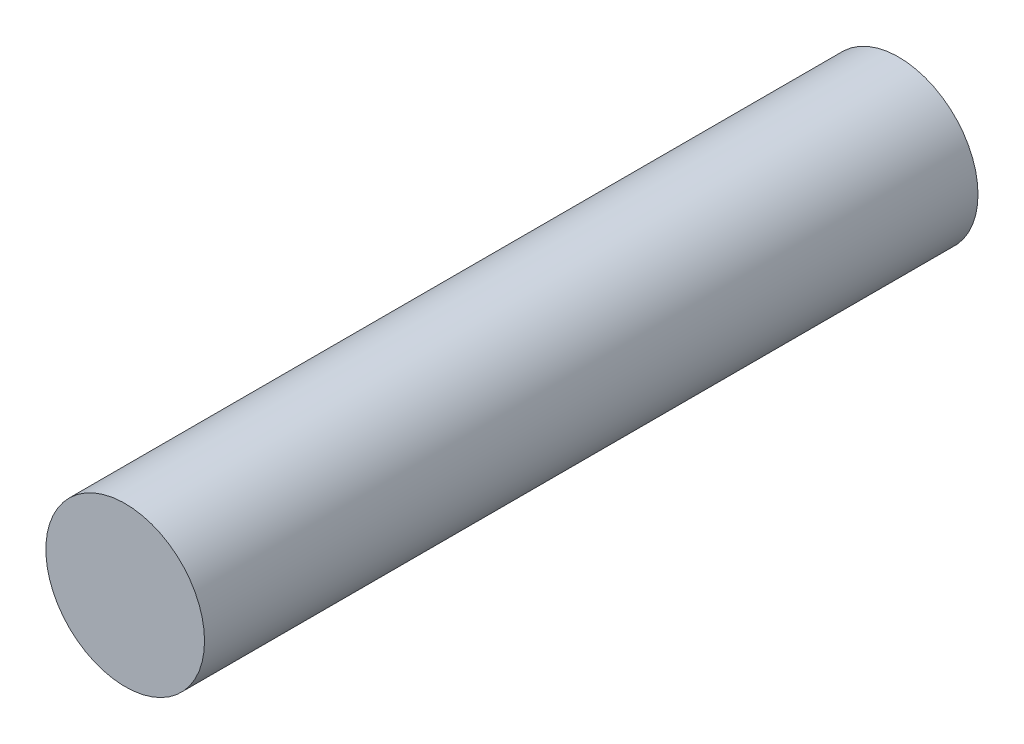
ISO-10303-21;
HEADER;
FILE_DESCRIPTION(('STEP AP214'),'2;1');
FILE_NAME('part.step','',(''),(''),'','','');
FILE_SCHEMA(('AUTOMOTIVE_DESIGN { 1 0 10303 214 1 1 1 1 }'));
ENDSEC;
DATA;
#1=APPLICATION_CONTEXT('core data for automotive mechanical design processes');
#2=APPLICATION_PROTOCOL_DEFINITION('international standard','automotive_design',2000,#1);
#3=PRODUCT_CONTEXT('',#1,'mechanical');
#4=PRODUCT('Part','Part','',(#3));
#5=PRODUCT_RELATED_PRODUCT_CATEGORY('part','',(#4));
#6=PRODUCT_DEFINITION_FORMATION('','',#4);
#7=PRODUCT_DEFINITION_CONTEXT('part definition',#1,'design');
#8=PRODUCT_DEFINITION('design','',#6,#7);
#9=PRODUCT_DEFINITION_SHAPE('','',#8);
#10=(LENGTH_UNIT() NAMED_UNIT(*) SI_UNIT(.MILLI.,.METRE.));
#11=(NAMED_UNIT(*) PLANE_ANGLE_UNIT() SI_UNIT($,.RADIAN.));
#12=(NAMED_UNIT(*) SI_UNIT($,.STERADIAN.) SOLID_ANGLE_UNIT());
#13=UNCERTAINTY_MEASURE_WITH_UNIT(LENGTH_MEASURE(1.E-05),#10,'distance_accuracy_value','');
#14=(GEOMETRIC_REPRESENTATION_CONTEXT(3) GLOBAL_UNCERTAINTY_ASSIGNED_CONTEXT((#13)) GLOBAL_UNIT_ASSIGNED_CONTEXT((#10,
#11,#12)) REPRESENTATION_CONTEXT('',''));
#15=CARTESIAN_POINT('',(0.,0.,0.));
#16=DIRECTION('',(0.,0.,1.));
#17=DIRECTION('',(1.,0.,0.));
#18=AXIS2_PLACEMENT_3D('',#15,#16,#17);
#19=CARTESIAN_POINT('',(0.,0.,35.));
#20=DIRECTION('',(0.,0.,-1.));
#21=DIRECTION('',(-1.,0.,0.));
#22=AXIS2_PLACEMENT_3D('',#19,#20,#21);
#23=CYLINDRICAL_SURFACE('',#22,7.1807);
#24=CARTESIAN_POINT('',(0.,0.,35.));
#25=DIRECTION('',(0.,0.,1.));
#26=DIRECTION('',(1.,0.,0.));
#27=AXIS2_PLACEMENT_3D('',#24,#25,#26);
#28=CIRCLE('',#27,7.1807);
#29=CARTESIAN_POINT('',(7.1807,0.,35.));
#30=VERTEX_POINT('',#29);
#31=EDGE_CURVE('E10',#30,#30,#28,.T.);
#32=ORIENTED_EDGE('',*,*,#31,.F.);
#33=EDGE_LOOP('',(#32));
#34=FACE_BOUND('',#33,.T.);
#35=CARTESIAN_POINT('',(0.,0.,-35.));
#36=DIRECTION('',(0.,0.,1.));
#37=DIRECTION('',(1.,0.,0.));
#38=AXIS2_PLACEMENT_3D('',#35,#36,#37);
#39=CIRCLE('',#38,7.1807);
#40=CARTESIAN_POINT('',(7.1807,0.,-35.));
#41=VERTEX_POINT('',#40);
#42=EDGE_CURVE('E46',#41,#41,#39,.T.);
#43=ORIENTED_EDGE('',*,*,#42,.T.);
#44=EDGE_LOOP('',(#43));
#45=FACE_BOUND('',#44,.T.);
#46=ADVANCED_FACE('F43',(#34,#45),#23,.T.);
#47=CARTESIAN_POINT('',(0.,0.,35.));
#48=DIRECTION('',(0.,0.,1.));
#49=DIRECTION('',(1.,0.,0.));
#50=AXIS2_PLACEMENT_3D('',#47,#48,#49);
#51=PLANE('',#50);
#52=ORIENTED_EDGE('',*,*,#31,.T.);
#53=EDGE_LOOP('',(#52));
#54=FACE_BOUND('',#53,.T.);
#55=ADVANCED_FACE('F60',(#54),#51,.T.);
#56=CARTESIAN_POINT('',(0.,0.,-35.));
#57=DIRECTION('',(0.,0.,1.));
#58=DIRECTION('',(1.,0.,0.));
#59=AXIS2_PLACEMENT_3D('',#56,#57,#58);
#60=PLANE('',#59);
#61=ORIENTED_EDGE('',*,*,#42,.F.);
#62=EDGE_LOOP('',(#61));
#63=FACE_BOUND('',#62,.T.);
#64=ADVANCED_FACE('F58',(#63),#60,.F.);
#65=CLOSED_SHELL('',(#46,#55,#64));
#66=MANIFOLD_SOLID_BREP('B2',#65);
#67=ADVANCED_BREP_SHAPE_REPRESENTATION('',(#18,#66),#14);
#68=SHAPE_DEFINITION_REPRESENTATION(#9,#67);
ENDSEC;
END-ISO-10303-21;
